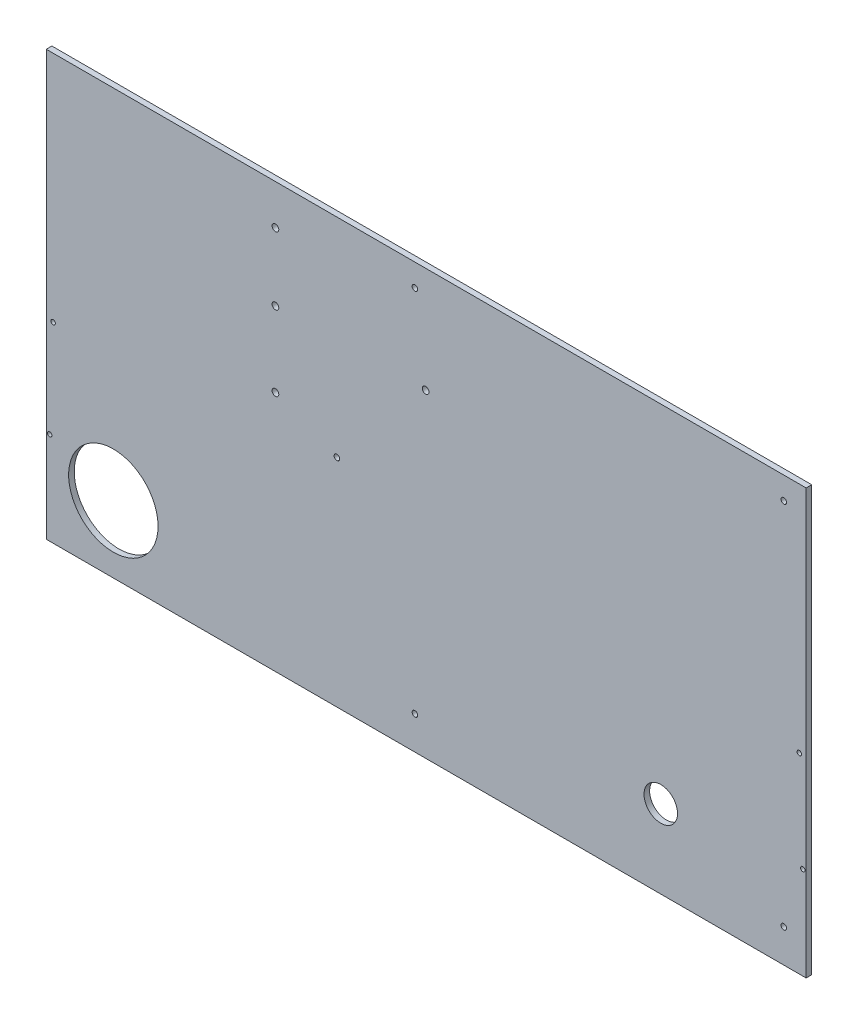
ISO-10303-21;
HEADER;
FILE_DESCRIPTION(('STEP AP214'),'2;1');
FILE_NAME('part.step','',(''),(''),'','','');
FILE_SCHEMA(('AUTOMOTIVE_DESIGN { 1 0 10303 214 1 1 1 1 }'));
ENDSEC;
DATA;
#1=APPLICATION_CONTEXT('core data for automotive mechanical design processes');
#2=APPLICATION_PROTOCOL_DEFINITION('international standard','automotive_design',2000,#1);
#3=PRODUCT_CONTEXT('',#1,'mechanical');
#4=PRODUCT('Part','Part','',(#3));
#5=PRODUCT_RELATED_PRODUCT_CATEGORY('part','',(#4));
#6=PRODUCT_DEFINITION_FORMATION('','',#4);
#7=PRODUCT_DEFINITION_CONTEXT('part definition',#1,'design');
#8=PRODUCT_DEFINITION('design','',#6,#7);
#9=PRODUCT_DEFINITION_SHAPE('','',#8);
#10=(LENGTH_UNIT() NAMED_UNIT(*) SI_UNIT(.MILLI.,.METRE.));
#11=(NAMED_UNIT(*) PLANE_ANGLE_UNIT() SI_UNIT($,.RADIAN.));
#12=(NAMED_UNIT(*) SI_UNIT($,.STERADIAN.) SOLID_ANGLE_UNIT());
#13=UNCERTAINTY_MEASURE_WITH_UNIT(LENGTH_MEASURE(1.E-05),#10,'distance_accuracy_value','');
#14=(GEOMETRIC_REPRESENTATION_CONTEXT(3) GLOBAL_UNCERTAINTY_ASSIGNED_CONTEXT((#13)) GLOBAL_UNIT_ASSIGNED_CONTEXT((#10,
#11,#12)) REPRESENTATION_CONTEXT('',''));
#15=CARTESIAN_POINT('',(0.,0.,0.));
#16=DIRECTION('',(0.,0.,1.));
#17=DIRECTION('',(1.,0.,0.));
#18=AXIS2_PLACEMENT_3D('',#15,#16,#17);
#19=CARTESIAN_POINT('',(0.,0.,6.35));
#20=DIRECTION('',(0.,0.,-1.));
#21=DIRECTION('',(-1.,0.,0.));
#22=AXIS2_PLACEMENT_3D('',#19,#20,#21);
#23=PLANE('',#22);
#24=CARTESIAN_POINT('',(-101.473,4.63549999999929,6.35));
#25=DIRECTION('',(0.,0.,1.));
#26=DIRECTION('',(1.,0.,0.));
#27=AXIS2_PLACEMENT_3D('',#24,#25,#26);
#28=CIRCLE('',#27,3.175);
#29=CARTESIAN_POINT('',(-98.2979999999996,4.63549999999929,6.35));
#30=VERTEX_POINT('',#29);
#31=EDGE_CURVE('E250',#30,#30,#28,.T.);
#32=ORIENTED_EDGE('',*,*,#31,.F.);
#33=EDGE_LOOP('',(#32));
#34=FACE_BOUND('',#33,.T.);
#35=CARTESIAN_POINT('',(-355.473,-164.9095,6.35));
#36=DIRECTION('',(0.,0.,1.));
#37=DIRECTION('',(1.,0.,0.));
#38=AXIS2_PLACEMENT_3D('',#35,#36,#37);
#39=CIRCLE('',#38,50.8);
#40=CARTESIAN_POINT('',(-304.673,-164.9095,6.35));
#41=VERTEX_POINT('',#40);
#42=EDGE_CURVE('E242',#41,#41,#39,.T.);
#43=ORIENTED_EDGE('',*,*,#42,.F.);
#44=EDGE_LOOP('',(#43));
#45=FACE_BOUND('',#44,.T.);
#46=CARTESIAN_POINT('',(406.273,215.7095,6.35));
#47=DIRECTION('',(0.,0.,1.));
#48=DIRECTION('',(1.,0.,0.));
#49=AXIS2_PLACEMENT_3D('',#46,#47,#48);
#50=CIRCLE('',#49,3.17499999999997);
#51=CARTESIAN_POINT('',(409.448,215.7095,6.35));
#52=VERTEX_POINT('',#51);
#53=EDGE_CURVE('E218',#52,#52,#50,.T.);
#54=ORIENTED_EDGE('',*,*,#53,.F.);
#55=EDGE_LOOP('',(#54));
#56=FACE_BOUND('',#55,.T.);
#57=CARTESIAN_POINT('',(406.273,-203.3905,6.35));
#58=DIRECTION('',(0.,0.,1.));
#59=DIRECTION('',(1.,0.,0.));
#60=AXIS2_PLACEMENT_3D('',#57,#58,#59);
#61=CIRCLE('',#60,3.17499999999997);
#62=CARTESIAN_POINT('',(409.448,-203.3905,6.35));
#63=VERTEX_POINT('',#62);
#64=EDGE_CURVE('E227',#63,#63,#61,.T.);
#65=ORIENTED_EDGE('',*,*,#64,.F.);
#66=EDGE_LOOP('',(#65));
#67=FACE_BOUND('',#66,.T.);
#68=CARTESIAN_POINT('',(-12.8270000000001,-203.3905,6.35));
#69=DIRECTION('',(0.,0.,1.));
#70=DIRECTION('',(1.,0.,0.));
#71=AXIS2_PLACEMENT_3D('',#68,#69,#70);
#72=CIRCLE('',#71,3.17499999999998);
#73=CARTESIAN_POINT('',(-9.65200000000011,-203.3905,6.35));
#74=VERTEX_POINT('',#73);
#75=EDGE_CURVE('E235',#74,#74,#72,.T.);
#76=ORIENTED_EDGE('',*,*,#75,.F.);
#77=EDGE_LOOP('',(#76));
#78=FACE_BOUND('',#77,.T.);
#79=CARTESIAN_POINT('',(-12.8270000000001,215.7095,6.35));
#80=DIRECTION('',(0.,0.,1.));
#81=DIRECTION('',(1.,0.,0.));
#82=AXIS2_PLACEMENT_3D('',#79,#80,#81);
#83=CIRCLE('',#82,3.17499999999998);
#84=CARTESIAN_POINT('',(-9.65200000000011,215.7095,6.35));
#85=VERTEX_POINT('',#84);
#86=EDGE_CURVE('E210',#85,#85,#83,.T.);
#87=ORIENTED_EDGE('',*,*,#86,.F.);
#88=EDGE_LOOP('',(#87));
#89=FACE_BOUND('',#88,.T.);
#90=CARTESIAN_POINT('',(-171.299738172,195.628424292552,6.35));
#91=DIRECTION('',(0.,0.,-1.));
#92=DIRECTION('',(-1.,0.,0.));
#93=AXIS2_PLACEMENT_3D('',#90,#91,#92);
#94=CIRCLE('',#93,3.81000000000002);
#95=CARTESIAN_POINT('',(-175.109738172,195.628424292552,6.35));
#96=VERTEX_POINT('',#95);
#97=EDGE_CURVE('E174',#96,#96,#94,.T.);
#98=ORIENTED_EDGE('',*,*,#97,.T.);
#99=EDGE_LOOP('',(#98));
#100=FACE_BOUND('',#99,.T.);
#101=CARTESIAN_POINT('',(-171.299738172,118.638765896112,6.35));
#102=DIRECTION('',(0.,0.,-1.));
#103=DIRECTION('',(-1.,0.,0.));
#104=AXIS2_PLACEMENT_3D('',#101,#102,#103);
#105=CIRCLE('',#104,3.81000000000001);
#106=CARTESIAN_POINT('',(-175.109738172,118.638765896112,6.35));
#107=VERTEX_POINT('',#106);
#108=EDGE_CURVE('E199',#107,#107,#105,.T.);
#109=ORIENTED_EDGE('',*,*,#108,.T.);
#110=EDGE_LOOP('',(#109));
#111=FACE_BOUND('',#110,.T.);
#112=CARTESIAN_POINT('',(-171.299738172,33.5325284381123,6.35));
#113=DIRECTION('',(0.,0.,-1.));
#114=DIRECTION('',(-1.,0.,0.));
#115=AXIS2_PLACEMENT_3D('',#112,#113,#114);
#116=CIRCLE('',#115,3.81000000000001);
#117=CARTESIAN_POINT('',(-175.109738172,33.5325284381123,6.35));
#118=VERTEX_POINT('',#117);
#119=EDGE_CURVE('E191',#118,#118,#116,.T.);
#120=ORIENTED_EDGE('',*,*,#119,.T.);
#121=EDGE_LOOP('',(#120));
#122=FACE_BOUND('',#121,.T.);
#123=CARTESIAN_POINT('',(-0.611738171951481,121.072249046552,6.35));
#124=DIRECTION('',(0.,0.,-1.));
#125=DIRECTION('',(-1.,0.,0.));
#126=AXIS2_PLACEMENT_3D('',#123,#124,#125);
#127=CIRCLE('',#126,3.81);
#128=CARTESIAN_POINT('',(-4.42173817195148,121.072249046552,6.35));
#129=VERTEX_POINT('',#128);
#130=EDGE_CURVE('E182',#129,#129,#127,.T.);
#131=ORIENTED_EDGE('',*,*,#130,.T.);
#132=EDGE_LOOP('',(#131));
#133=FACE_BOUND('',#132,.T.);
#134=CARTESIAN_POINT('',(266.528550000011,-152.344105106299,6.35));
#135=DIRECTION('',(0.,0.,1.));
#136=DIRECTION('',(1.,0.,0.));
#137=AXIS2_PLACEMENT_3D('',#134,#135,#136);
#138=CIRCLE('',#137,19.05);
#139=CARTESIAN_POINT('',(285.578550000011,-152.344105106299,6.35));
#140=VERTEX_POINT('',#139);
#141=EDGE_CURVE('E170',#140,#140,#138,.T.);
#142=ORIENTED_EDGE('',*,*,#141,.F.);
#143=EDGE_LOOP('',(#142));
#144=FACE_BOUND('',#143,.T.);
#145=DIRECTION('',(0.,1.,0.));
#146=VECTOR('',#145,1.);
#147=CARTESIAN_POINT('',(431.673,-241.1095,6.35));
#148=LINE('',#147,#146);
#149=CARTESIAN_POINT('',(431.673,-241.1095,6.35));
#150=VERTEX_POINT('',#149);
#151=CARTESIAN_POINT('',(431.673,241.1095,6.35));
#152=VERTEX_POINT('',#151);
#153=EDGE_CURVE('E97',#150,#152,#148,.T.);
#154=ORIENTED_EDGE('',*,*,#153,.T.);
#155=DIRECTION('',(-1.,0.,0.));
#156=VECTOR('',#155,1.);
#157=CARTESIAN_POINT('',(-431.673,241.1095,6.35));
#158=LINE('',#157,#156);
#159=CARTESIAN_POINT('',(-431.673,241.1095,6.35));
#160=VERTEX_POINT('',#159);
#161=EDGE_CURVE('E92',#152,#160,#158,.T.);
#162=ORIENTED_EDGE('',*,*,#161,.T.);
#163=DIRECTION('',(0.,-1.,0.));
#164=VECTOR('',#163,1.);
#165=CARTESIAN_POINT('',(-431.673,-241.1095,6.35));
#166=LINE('',#165,#164);
#167=CARTESIAN_POINT('',(-431.673,-241.1095,6.35));
#168=VERTEX_POINT('',#167);
#169=EDGE_CURVE('E95',#160,#168,#166,.T.);
#170=ORIENTED_EDGE('',*,*,#169,.T.);
#171=DIRECTION('',(1.,0.,0.));
#172=VECTOR('',#171,1.);
#173=CARTESIAN_POINT('',(-431.673,-241.1095,6.35));
#174=LINE('',#173,#172);
#175=EDGE_CURVE('E62',#168,#150,#174,.T.);
#176=ORIENTED_EDGE('',*,*,#175,.T.);
#177=EDGE_LOOP('',(#154,#162,#170,#176));
#178=FACE_BOUND('',#177,.T.);
#179=CARTESIAN_POINT('',(427.847603152867,-135.890923479345,6.35));
#180=DIRECTION('',(0.,0.,1.));
#181=DIRECTION('',(-1.,0.,0.));
#182=AXIS2_PLACEMENT_3D('',#179,#180,#181);
#183=CIRCLE('',#182,2.54000000000001);
#184=CARTESIAN_POINT('',(425.307603152867,-135.890923479345,6.35));
#185=VERTEX_POINT('',#184);
#186=EDGE_CURVE('E118',#185,#185,#183,.T.);
#187=ORIENTED_EDGE('',*,*,#186,.F.);
#188=EDGE_LOOP('',(#187));
#189=FACE_BOUND('',#188,.T.);
#190=CARTESIAN_POINT('',(-423.918892064,-23.5614445121345,6.35));
#191=DIRECTION('',(0.,0.,1.));
#192=DIRECTION('',(1.,0.,0.));
#193=AXIS2_PLACEMENT_3D('',#190,#191,#192);
#194=CIRCLE('',#193,2.54000000000001);
#195=CARTESIAN_POINT('',(-421.378892064,-23.5614445121345,6.35));
#196=VERTEX_POINT('',#195);
#197=EDGE_CURVE('E142',#196,#196,#194,.T.);
#198=ORIENTED_EDGE('',*,*,#197,.F.);
#199=EDGE_LOOP('',(#198));
#200=FACE_BOUND('',#199,.T.);
#201=CARTESIAN_POINT('',(-427.847603152867,-135.890923479345,6.35));
#202=DIRECTION('',(0.,0.,1.));
#203=DIRECTION('',(1.,0.,0.));
#204=AXIS2_PLACEMENT_3D('',#201,#202,#203);
#205=CIRCLE('',#204,2.54000000000001);
#206=CARTESIAN_POINT('',(-425.307603152867,-135.890923479345,6.35));
#207=VERTEX_POINT('',#206);
#208=EDGE_CURVE('E150',#207,#207,#205,.T.);
#209=ORIENTED_EDGE('',*,*,#208,.F.);
#210=EDGE_LOOP('',(#209));
#211=FACE_BOUND('',#210,.T.);
#212=CARTESIAN_POINT('',(423.918892064,-23.5614445121344,6.35));
#213=DIRECTION('',(0.,0.,1.));
#214=DIRECTION('',(-1.,0.,0.));
#215=AXIS2_PLACEMENT_3D('',#212,#213,#214);
#216=CIRCLE('',#215,2.54000000000001);
#217=CARTESIAN_POINT('',(421.378892064,-23.5614445121344,6.35));
#218=VERTEX_POINT('',#217);
#219=EDGE_CURVE('E158',#218,#218,#216,.T.);
#220=ORIENTED_EDGE('',*,*,#219,.F.);
#221=EDGE_LOOP('',(#220));
#222=FACE_BOUND('',#221,.T.);
#223=ADVANCED_FACE('F44',(#34,#45,#56,#67,#78,#89,#100,#111,#122,#133,#144,#178,#189,#200,#211,
#222),#23,.F.);
#224=CARTESIAN_POINT('',(0.,0.,0.));
#225=DIRECTION('',(0.,0.,-1.));
#226=DIRECTION('',(-1.,0.,0.));
#227=AXIS2_PLACEMENT_3D('',#224,#225,#226);
#228=PLANE('',#227);
#229=CARTESIAN_POINT('',(-101.473,4.63549999999929,0.));
#230=DIRECTION('',(0.,0.,1.));
#231=DIRECTION('',(1.,0.,0.));
#232=AXIS2_PLACEMENT_3D('',#229,#230,#231);
#233=CIRCLE('',#232,3.175);
#234=CARTESIAN_POINT('',(-98.2979999999996,4.63549999999929,0.));
#235=VERTEX_POINT('',#234);
#236=EDGE_CURVE('E246',#235,#235,#233,.T.);
#237=ORIENTED_EDGE('',*,*,#236,.T.);
#238=EDGE_LOOP('',(#237));
#239=FACE_BOUND('',#238,.T.);
#240=CARTESIAN_POINT('',(-355.473,-164.9095,0.));
#241=DIRECTION('',(0.,0.,1.));
#242=DIRECTION('',(1.,0.,0.));
#243=AXIS2_PLACEMENT_3D('',#240,#241,#242);
#244=CIRCLE('',#243,50.8);
#245=CARTESIAN_POINT('',(-304.673,-164.9095,0.));
#246=VERTEX_POINT('',#245);
#247=EDGE_CURVE('E223',#246,#246,#244,.T.);
#248=ORIENTED_EDGE('',*,*,#247,.T.);
#249=EDGE_LOOP('',(#248));
#250=FACE_BOUND('',#249,.T.);
#251=CARTESIAN_POINT('',(406.273,215.7095,0.));
#252=DIRECTION('',(0.,0.,1.));
#253=DIRECTION('',(1.,0.,0.));
#254=AXIS2_PLACEMENT_3D('',#251,#252,#253);
#255=CIRCLE('',#254,3.17499999999997);
#256=CARTESIAN_POINT('',(409.448,215.7095,0.));
#257=VERTEX_POINT('',#256);
#258=EDGE_CURVE('E222',#257,#257,#255,.T.);
#259=ORIENTED_EDGE('',*,*,#258,.T.);
#260=EDGE_LOOP('',(#259));
#261=FACE_BOUND('',#260,.T.);
#262=CARTESIAN_POINT('',(406.273,-203.3905,0.));
#263=DIRECTION('',(0.,0.,1.));
#264=DIRECTION('',(1.,0.,0.));
#265=AXIS2_PLACEMENT_3D('',#262,#263,#264);
#266=CIRCLE('',#265,3.17499999999997);
#267=CARTESIAN_POINT('',(409.448,-203.3905,0.));
#268=VERTEX_POINT('',#267);
#269=EDGE_CURVE('E231',#268,#268,#266,.T.);
#270=ORIENTED_EDGE('',*,*,#269,.T.);
#271=EDGE_LOOP('',(#270));
#272=FACE_BOUND('',#271,.T.);
#273=CARTESIAN_POINT('',(-12.8270000000001,-203.3905,0.));
#274=DIRECTION('',(0.,0.,1.));
#275=DIRECTION('',(1.,0.,0.));
#276=AXIS2_PLACEMENT_3D('',#273,#274,#275);
#277=CIRCLE('',#276,3.17499999999998);
#278=CARTESIAN_POINT('',(-9.65200000000011,-203.3905,0.));
#279=VERTEX_POINT('',#278);
#280=EDGE_CURVE('E214',#279,#279,#277,.T.);
#281=ORIENTED_EDGE('',*,*,#280,.T.);
#282=EDGE_LOOP('',(#281));
#283=FACE_BOUND('',#282,.T.);
#284=CARTESIAN_POINT('',(-12.8270000000001,215.7095,0.));
#285=DIRECTION('',(0.,0.,1.));
#286=DIRECTION('',(1.,0.,0.));
#287=AXIS2_PLACEMENT_3D('',#284,#285,#286);
#288=CIRCLE('',#287,3.17499999999998);
#289=CARTESIAN_POINT('',(-9.65200000000011,215.7095,0.));
#290=VERTEX_POINT('',#289);
#291=EDGE_CURVE('E183',#290,#290,#288,.T.);
#292=ORIENTED_EDGE('',*,*,#291,.T.);
#293=EDGE_LOOP('',(#292));
#294=FACE_BOUND('',#293,.T.);
#295=CARTESIAN_POINT('',(-171.299738172,195.628424292552,0.));
#296=DIRECTION('',(0.,0.,-1.));
#297=DIRECTION('',(-1.,0.,0.));
#298=AXIS2_PLACEMENT_3D('',#295,#296,#297);
#299=CIRCLE('',#298,3.81000000000002);
#300=CARTESIAN_POINT('',(-175.109738172,195.628424292552,0.));
#301=VERTEX_POINT('',#300);
#302=EDGE_CURVE('E203',#301,#301,#299,.T.);
#303=ORIENTED_EDGE('',*,*,#302,.F.);
#304=EDGE_LOOP('',(#303));
#305=FACE_BOUND('',#304,.T.);
#306=CARTESIAN_POINT('',(-171.299738172,118.638765896112,0.));
#307=DIRECTION('',(0.,0.,-1.));
#308=DIRECTION('',(-1.,0.,0.));
#309=AXIS2_PLACEMENT_3D('',#306,#307,#308);
#310=CIRCLE('',#309,3.81000000000001);
#311=CARTESIAN_POINT('',(-175.109738172,118.638765896112,0.));
#312=VERTEX_POINT('',#311);
#313=EDGE_CURVE('E195',#312,#312,#310,.T.);
#314=ORIENTED_EDGE('',*,*,#313,.F.);
#315=EDGE_LOOP('',(#314));
#316=FACE_BOUND('',#315,.T.);
#317=CARTESIAN_POINT('',(-171.299738172,33.5325284381123,0.));
#318=DIRECTION('',(0.,0.,-1.));
#319=DIRECTION('',(-1.,0.,0.));
#320=AXIS2_PLACEMENT_3D('',#317,#318,#319);
#321=CIRCLE('',#320,3.81000000000001);
#322=CARTESIAN_POINT('',(-175.109738172,33.5325284381123,0.));
#323=VERTEX_POINT('',#322);
#324=EDGE_CURVE('E187',#323,#323,#321,.T.);
#325=ORIENTED_EDGE('',*,*,#324,.F.);
#326=EDGE_LOOP('',(#325));
#327=FACE_BOUND('',#326,.T.);
#328=CARTESIAN_POINT('',(-0.611738171951481,121.072249046552,0.));
#329=DIRECTION('',(0.,0.,-1.));
#330=DIRECTION('',(-1.,0.,0.));
#331=AXIS2_PLACEMENT_3D('',#328,#329,#330);
#332=CIRCLE('',#331,3.81);
#333=CARTESIAN_POINT('',(-4.42173817195148,121.072249046552,0.));
#334=VERTEX_POINT('',#333);
#335=EDGE_CURVE('E178',#334,#334,#332,.T.);
#336=ORIENTED_EDGE('',*,*,#335,.F.);
#337=EDGE_LOOP('',(#336));
#338=FACE_BOUND('',#337,.T.);
#339=CARTESIAN_POINT('',(266.528550000011,-152.344105106299,0.));
#340=DIRECTION('',(0.,0.,1.));
#341=DIRECTION('',(1.,0.,0.));
#342=AXIS2_PLACEMENT_3D('',#339,#340,#341);
#343=CIRCLE('',#342,19.05);
#344=CARTESIAN_POINT('',(285.578550000011,-152.344105106299,0.));
#345=VERTEX_POINT('',#344);
#346=EDGE_CURVE('E166',#345,#345,#343,.T.);
#347=ORIENTED_EDGE('',*,*,#346,.T.);
#348=EDGE_LOOP('',(#347));
#349=FACE_BOUND('',#348,.T.);
#350=CARTESIAN_POINT('',(-427.847603152867,-135.890923479345,0.));
#351=DIRECTION('',(0.,0.,1.));
#352=DIRECTION('',(1.,0.,0.));
#353=AXIS2_PLACEMENT_3D('',#350,#351,#352);
#354=CIRCLE('',#353,2.54000000000001);
#355=CARTESIAN_POINT('',(-425.307603152867,-135.890923479345,0.));
#356=VERTEX_POINT('',#355);
#357=EDGE_CURVE('E154',#356,#356,#354,.T.);
#358=ORIENTED_EDGE('',*,*,#357,.T.);
#359=EDGE_LOOP('',(#358));
#360=FACE_BOUND('',#359,.T.);
#361=CARTESIAN_POINT('',(427.847603152867,-135.890923479345,0.));
#362=DIRECTION('',(0.,0.,1.));
#363=DIRECTION('',(-1.,0.,0.));
#364=AXIS2_PLACEMENT_3D('',#361,#362,#363);
#365=CIRCLE('',#364,2.54000000000001);
#366=CARTESIAN_POINT('',(425.307603152867,-135.890923479345,0.));
#367=VERTEX_POINT('',#366);
#368=EDGE_CURVE('E138',#367,#367,#365,.T.);
#369=ORIENTED_EDGE('',*,*,#368,.T.);
#370=EDGE_LOOP('',(#369));
#371=FACE_BOUND('',#370,.T.);
#372=DIRECTION('',(0.,1.,0.));
#373=VECTOR('',#372,1.);
#374=CARTESIAN_POINT('',(431.673,-241.1095,0.));
#375=LINE('',#374,#373);
#376=CARTESIAN_POINT('',(431.673,-241.1095,0.));
#377=VERTEX_POINT('',#376);
#378=CARTESIAN_POINT('',(431.673,241.1095,0.));
#379=VERTEX_POINT('',#378);
#380=EDGE_CURVE('E114',#377,#379,#375,.T.);
#381=ORIENTED_EDGE('',*,*,#380,.F.);
#382=DIRECTION('',(1.,0.,0.));
#383=VECTOR('',#382,1.);
#384=CARTESIAN_POINT('',(-431.673,-241.1095,0.));
#385=LINE('',#384,#383);
#386=CARTESIAN_POINT('',(-431.673,-241.1095,0.));
#387=VERTEX_POINT('',#386);
#388=EDGE_CURVE('E85',#387,#377,#385,.T.);
#389=ORIENTED_EDGE('',*,*,#388,.F.);
#390=DIRECTION('',(0.,-1.,0.));
#391=VECTOR('',#390,1.);
#392=CARTESIAN_POINT('',(-431.673,-241.1095,0.));
#393=LINE('',#392,#391);
#394=CARTESIAN_POINT('',(-431.673,241.1095,0.));
#395=VERTEX_POINT('',#394);
#396=EDGE_CURVE('E79',#395,#387,#393,.T.);
#397=ORIENTED_EDGE('',*,*,#396,.F.);
#398=DIRECTION('',(-1.,0.,0.));
#399=VECTOR('',#398,1.);
#400=CARTESIAN_POINT('',(-431.673,241.1095,0.));
#401=LINE('',#400,#399);
#402=EDGE_CURVE('E102',#379,#395,#401,.T.);
#403=ORIENTED_EDGE('',*,*,#402,.F.);
#404=EDGE_LOOP('',(#381,#389,#397,#403));
#405=FACE_BOUND('',#404,.T.);
#406=CARTESIAN_POINT('',(-423.918892064,-23.5614445121345,0.));
#407=DIRECTION('',(0.,0.,1.));
#408=DIRECTION('',(1.,0.,0.));
#409=AXIS2_PLACEMENT_3D('',#406,#407,#408);
#410=CIRCLE('',#409,2.54000000000001);
#411=CARTESIAN_POINT('',(-421.378892064,-23.5614445121345,0.));
#412=VERTEX_POINT('',#411);
#413=EDGE_CURVE('E146',#412,#412,#410,.T.);
#414=ORIENTED_EDGE('',*,*,#413,.T.);
#415=EDGE_LOOP('',(#414));
#416=FACE_BOUND('',#415,.T.);
#417=CARTESIAN_POINT('',(423.918892064,-23.5614445121344,0.));
#418=DIRECTION('',(0.,0.,1.));
#419=DIRECTION('',(-1.,0.,0.));
#420=AXIS2_PLACEMENT_3D('',#417,#418,#419);
#421=CIRCLE('',#420,2.54000000000001);
#422=CARTESIAN_POINT('',(421.378892064,-23.5614445121344,0.));
#423=VERTEX_POINT('',#422);
#424=EDGE_CURVE('E162',#423,#423,#421,.T.);
#425=ORIENTED_EDGE('',*,*,#424,.T.);
#426=EDGE_LOOP('',(#425));
#427=FACE_BOUND('',#426,.T.);
#428=ADVANCED_FACE('F132',(#239,#250,#261,#272,#283,#294,#305,#316,#327,#338,#349,#360,#371,
#405,#416,#427),#228,.T.);
#429=CARTESIAN_POINT('',(431.673,-241.1095,6.35));
#430=DIRECTION('',(-1.,0.,0.));
#431=DIRECTION('',(0.,-1.,0.));
#432=AXIS2_PLACEMENT_3D('',#429,#430,#431);
#433=PLANE('',#432);
#434=ORIENTED_EDGE('',*,*,#380,.T.);
#435=DIRECTION('',(0.,0.,-1.));
#436=VECTOR('',#435,1.);
#437=CARTESIAN_POINT('',(431.673,241.1095,6.35));
#438=LINE('',#437,#436);
#439=EDGE_CURVE('E11',#152,#379,#438,.T.);
#440=ORIENTED_EDGE('',*,*,#439,.F.);
#441=ORIENTED_EDGE('',*,*,#153,.F.);
#442=DIRECTION('',(0.,0.,-1.));
#443=VECTOR('',#442,1.);
#444=CARTESIAN_POINT('',(431.673,-241.1095,6.35));
#445=LINE('',#444,#443);
#446=EDGE_CURVE('E110',#150,#377,#445,.T.);
#447=ORIENTED_EDGE('',*,*,#446,.T.);
#448=EDGE_LOOP('',(#434,#440,#441,#447));
#449=FACE_BOUND('',#448,.T.);
#450=ADVANCED_FACE('F46',(#449),#433,.F.);
#451=CARTESIAN_POINT('',(-431.673,241.1095,6.35));
#452=DIRECTION('',(0.,-1.,0.));
#453=DIRECTION('',(1.,0.,0.));
#454=AXIS2_PLACEMENT_3D('',#451,#452,#453);
#455=PLANE('',#454);
#456=ORIENTED_EDGE('',*,*,#402,.T.);
#457=DIRECTION('',(0.,0.,-1.));
#458=VECTOR('',#457,1.);
#459=CARTESIAN_POINT('',(-431.673,241.1095,6.35));
#460=LINE('',#459,#458);
#461=EDGE_CURVE('E54',#160,#395,#460,.T.);
#462=ORIENTED_EDGE('',*,*,#461,.F.);
#463=ORIENTED_EDGE('',*,*,#161,.F.);
#464=ORIENTED_EDGE('',*,*,#439,.T.);
#465=EDGE_LOOP('',(#456,#462,#463,#464));
#466=FACE_BOUND('',#465,.T.);
#467=ADVANCED_FACE('F101',(#466),#455,.F.);
#468=CARTESIAN_POINT('',(-431.673,-241.1095,6.35));
#469=DIRECTION('',(1.,0.,0.));
#470=DIRECTION('',(0.,1.,0.));
#471=AXIS2_PLACEMENT_3D('',#468,#469,#470);
#472=PLANE('',#471);
#473=ORIENTED_EDGE('',*,*,#396,.T.);
#474=DIRECTION('',(0.,0.,-1.));
#475=VECTOR('',#474,1.);
#476=CARTESIAN_POINT('',(-431.673,-241.1095,6.35));
#477=LINE('',#476,#475);
#478=EDGE_CURVE('E104',#168,#387,#477,.T.);
#479=ORIENTED_EDGE('',*,*,#478,.F.);
#480=ORIENTED_EDGE('',*,*,#169,.F.);
#481=ORIENTED_EDGE('',*,*,#461,.T.);
#482=EDGE_LOOP('',(#473,#479,#480,#481));
#483=FACE_BOUND('',#482,.T.);
#484=ADVANCED_FACE('F105',(#483),#472,.F.);
#485=CARTESIAN_POINT('',(-431.673,-241.1095,6.35));
#486=DIRECTION('',(0.,1.,0.));
#487=DIRECTION('',(-1.,0.,0.));
#488=AXIS2_PLACEMENT_3D('',#485,#486,#487);
#489=PLANE('',#488);
#490=ORIENTED_EDGE('',*,*,#388,.T.);
#491=ORIENTED_EDGE('',*,*,#446,.F.);
#492=ORIENTED_EDGE('',*,*,#175,.F.);
#493=ORIENTED_EDGE('',*,*,#478,.T.);
#494=EDGE_LOOP('',(#490,#491,#492,#493));
#495=FACE_BOUND('',#494,.T.);
#496=ADVANCED_FACE('F129',(#495),#489,.F.);
#497=CARTESIAN_POINT('',(427.847603152867,-135.890923479345,6.35));
#498=DIRECTION('',(0.,0.,-1.));
#499=DIRECTION('',(-1.,0.,0.));
#500=AXIS2_PLACEMENT_3D('',#497,#498,#499);
#501=CYLINDRICAL_SURFACE('',#500,2.54000000000001);
#502=ORIENTED_EDGE('',*,*,#186,.T.);
#503=EDGE_LOOP('',(#502));
#504=FACE_BOUND('',#503,.T.);
#505=ORIENTED_EDGE('',*,*,#368,.F.);
#506=EDGE_LOOP('',(#505));
#507=FACE_BOUND('',#506,.T.);
#508=ADVANCED_FACE('F315',(#504,#507),#501,.F.);
#509=CARTESIAN_POINT('',(-423.918892064,-23.5614445121345,6.35));
#510=DIRECTION('',(0.,0.,-1.));
#511=DIRECTION('',(-1.,0.,0.));
#512=AXIS2_PLACEMENT_3D('',#509,#510,#511);
#513=CYLINDRICAL_SURFACE('',#512,2.54000000000001);
#514=ORIENTED_EDGE('',*,*,#197,.T.);
#515=EDGE_LOOP('',(#514));
#516=FACE_BOUND('',#515,.T.);
#517=ORIENTED_EDGE('',*,*,#413,.F.);
#518=EDGE_LOOP('',(#517));
#519=FACE_BOUND('',#518,.T.);
#520=ADVANCED_FACE('F311',(#516,#519),#513,.F.);
#521=CARTESIAN_POINT('',(-427.847603152867,-135.890923479345,6.35));
#522=DIRECTION('',(0.,0.,-1.));
#523=DIRECTION('',(-1.,0.,0.));
#524=AXIS2_PLACEMENT_3D('',#521,#522,#523);
#525=CYLINDRICAL_SURFACE('',#524,2.54000000000001);
#526=ORIENTED_EDGE('',*,*,#208,.T.);
#527=EDGE_LOOP('',(#526));
#528=FACE_BOUND('',#527,.T.);
#529=ORIENTED_EDGE('',*,*,#357,.F.);
#530=EDGE_LOOP('',(#529));
#531=FACE_BOUND('',#530,.T.);
#532=ADVANCED_FACE('F303',(#528,#531),#525,.F.);
#533=CARTESIAN_POINT('',(423.918892064,-23.5614445121344,6.35));
#534=DIRECTION('',(0.,0.,-1.));
#535=DIRECTION('',(-1.,0.,0.));
#536=AXIS2_PLACEMENT_3D('',#533,#534,#535);
#537=CYLINDRICAL_SURFACE('',#536,2.54000000000001);
#538=ORIENTED_EDGE('',*,*,#219,.T.);
#539=EDGE_LOOP('',(#538));
#540=FACE_BOUND('',#539,.T.);
#541=ORIENTED_EDGE('',*,*,#424,.F.);
#542=EDGE_LOOP('',(#541));
#543=FACE_BOUND('',#542,.T.);
#544=ADVANCED_FACE('F293',(#540,#543),#537,.F.);
#545=CARTESIAN_POINT('',(266.528550000011,-152.344105106299,0.));
#546=DIRECTION('',(0.,0.,1.));
#547=DIRECTION('',(1.,0.,0.));
#548=AXIS2_PLACEMENT_3D('',#545,#546,#547);
#549=CYLINDRICAL_SURFACE('',#548,19.05);
#550=ORIENTED_EDGE('',*,*,#346,.F.);
#551=EDGE_LOOP('',(#550));
#552=FACE_BOUND('',#551,.T.);
#553=ORIENTED_EDGE('',*,*,#141,.T.);
#554=EDGE_LOOP('',(#553));
#555=FACE_BOUND('',#554,.T.);
#556=ADVANCED_FACE('F290',(#552,#555),#549,.F.);
#557=CARTESIAN_POINT('',(-0.611738171951481,121.072249046552,6.35));
#558=DIRECTION('',(0.,0.,-1.));
#559=DIRECTION('',(-1.,0.,0.));
#560=AXIS2_PLACEMENT_3D('',#557,#558,#559);
#561=CYLINDRICAL_SURFACE('',#560,3.81);
#562=ORIENTED_EDGE('',*,*,#130,.F.);
#563=EDGE_LOOP('',(#562));
#564=FACE_BOUND('',#563,.T.);
#565=ORIENTED_EDGE('',*,*,#335,.T.);
#566=EDGE_LOOP('',(#565));
#567=FACE_BOUND('',#566,.T.);
#568=ADVANCED_FACE('F292',(#564,#567),#561,.F.);
#569=CARTESIAN_POINT('',(-171.299738172,33.5325284381123,6.35));
#570=DIRECTION('',(0.,0.,-1.));
#571=DIRECTION('',(-1.,0.,0.));
#572=AXIS2_PLACEMENT_3D('',#569,#570,#571);
#573=CYLINDRICAL_SURFACE('',#572,3.81000000000001);
#574=ORIENTED_EDGE('',*,*,#119,.F.);
#575=EDGE_LOOP('',(#574));
#576=FACE_BOUND('',#575,.T.);
#577=ORIENTED_EDGE('',*,*,#324,.T.);
#578=EDGE_LOOP('',(#577));
#579=FACE_BOUND('',#578,.T.);
#580=ADVANCED_FACE('F300',(#576,#579),#573,.F.);
#581=CARTESIAN_POINT('',(-171.299738172,118.638765896112,6.35));
#582=DIRECTION('',(0.,0.,-1.));
#583=DIRECTION('',(-1.,0.,0.));
#584=AXIS2_PLACEMENT_3D('',#581,#582,#583);
#585=CYLINDRICAL_SURFACE('',#584,3.81000000000001);
#586=ORIENTED_EDGE('',*,*,#108,.F.);
#587=EDGE_LOOP('',(#586));
#588=FACE_BOUND('',#587,.T.);
#589=ORIENTED_EDGE('',*,*,#313,.T.);
#590=EDGE_LOOP('',(#589));
#591=FACE_BOUND('',#590,.T.);
#592=ADVANCED_FACE('F406',(#588,#591),#585,.F.);
#593=CARTESIAN_POINT('',(-171.299738172,195.628424292552,6.35));
#594=DIRECTION('',(0.,0.,-1.));
#595=DIRECTION('',(-1.,0.,0.));
#596=AXIS2_PLACEMENT_3D('',#593,#594,#595);
#597=CYLINDRICAL_SURFACE('',#596,3.81000000000002);
#598=ORIENTED_EDGE('',*,*,#97,.F.);
#599=EDGE_LOOP('',(#598));
#600=FACE_BOUND('',#599,.T.);
#601=ORIENTED_EDGE('',*,*,#302,.T.);
#602=EDGE_LOOP('',(#601));
#603=FACE_BOUND('',#602,.T.);
#604=ADVANCED_FACE('F395',(#600,#603),#597,.F.);
#605=CARTESIAN_POINT('',(-12.8270000000001,215.7095,0.));
#606=DIRECTION('',(0.,0.,1.));
#607=DIRECTION('',(1.,0.,0.));
#608=AXIS2_PLACEMENT_3D('',#605,#606,#607);
#609=CYLINDRICAL_SURFACE('',#608,3.17499999999998);
#610=ORIENTED_EDGE('',*,*,#291,.F.);
#611=EDGE_LOOP('',(#610));
#612=FACE_BOUND('',#611,.T.);
#613=ORIENTED_EDGE('',*,*,#86,.T.);
#614=EDGE_LOOP('',(#613));
#615=FACE_BOUND('',#614,.T.);
#616=ADVANCED_FACE('F384',(#612,#615),#609,.F.);
#617=CARTESIAN_POINT('',(-12.8270000000001,-203.3905,0.));
#618=DIRECTION('',(0.,0.,1.));
#619=DIRECTION('',(1.,0.,0.));
#620=AXIS2_PLACEMENT_3D('',#617,#618,#619);
#621=CYLINDRICAL_SURFACE('',#620,3.17499999999998);
#622=ORIENTED_EDGE('',*,*,#280,.F.);
#623=EDGE_LOOP('',(#622));
#624=FACE_BOUND('',#623,.T.);
#625=ORIENTED_EDGE('',*,*,#75,.T.);
#626=EDGE_LOOP('',(#625));
#627=FACE_BOUND('',#626,.T.);
#628=ADVANCED_FACE('F373',(#624,#627),#621,.F.);
#629=CARTESIAN_POINT('',(406.273,-203.3905,0.));
#630=DIRECTION('',(0.,0.,1.));
#631=DIRECTION('',(1.,0.,0.));
#632=AXIS2_PLACEMENT_3D('',#629,#630,#631);
#633=CYLINDRICAL_SURFACE('',#632,3.17499999999997);
#634=ORIENTED_EDGE('',*,*,#269,.F.);
#635=EDGE_LOOP('',(#634));
#636=FACE_BOUND('',#635,.T.);
#637=ORIENTED_EDGE('',*,*,#64,.T.);
#638=EDGE_LOOP('',(#637));
#639=FACE_BOUND('',#638,.T.);
#640=ADVANCED_FACE('F362',(#636,#639),#633,.F.);
#641=CARTESIAN_POINT('',(406.273,215.7095,0.));
#642=DIRECTION('',(0.,0.,1.));
#643=DIRECTION('',(1.,0.,0.));
#644=AXIS2_PLACEMENT_3D('',#641,#642,#643);
#645=CYLINDRICAL_SURFACE('',#644,3.17499999999997);
#646=ORIENTED_EDGE('',*,*,#258,.F.);
#647=EDGE_LOOP('',(#646));
#648=FACE_BOUND('',#647,.T.);
#649=ORIENTED_EDGE('',*,*,#53,.T.);
#650=EDGE_LOOP('',(#649));
#651=FACE_BOUND('',#650,.T.);
#652=ADVANCED_FACE('F350',(#648,#651),#645,.F.);
#653=CARTESIAN_POINT('',(-355.473,-164.9095,0.));
#654=DIRECTION('',(0.,0.,1.));
#655=DIRECTION('',(1.,0.,0.));
#656=AXIS2_PLACEMENT_3D('',#653,#654,#655);
#657=CYLINDRICAL_SURFACE('',#656,50.8);
#658=ORIENTED_EDGE('',*,*,#247,.F.);
#659=EDGE_LOOP('',(#658));
#660=FACE_BOUND('',#659,.T.);
#661=ORIENTED_EDGE('',*,*,#42,.T.);
#662=EDGE_LOOP('',(#661));
#663=FACE_BOUND('',#662,.T.);
#664=ADVANCED_FACE('F263',(#660,#663),#657,.F.);
#665=CARTESIAN_POINT('',(-101.473,4.63549999999929,0.));
#666=DIRECTION('',(0.,0.,1.));
#667=DIRECTION('',(1.,0.,0.));
#668=AXIS2_PLACEMENT_3D('',#665,#666,#667);
#669=CYLINDRICAL_SURFACE('',#668,3.175);
#670=ORIENTED_EDGE('',*,*,#236,.F.);
#671=EDGE_LOOP('',(#670));
#672=FACE_BOUND('',#671,.T.);
#673=ORIENTED_EDGE('',*,*,#31,.T.);
#674=EDGE_LOOP('',(#673));
#675=FACE_BOUND('',#674,.T.);
#676=ADVANCED_FACE('F260',(#672,#675),#669,.F.);
#677=CLOSED_SHELL('',(#223,#428,#450,#467,#484,#496,#508,#520,#532,#544,#556,#568,#580,#592,
#604,#616,#628,#640,#652,#664,#676));
#678=MANIFOLD_SOLID_BREP('B2',#677);
#679=ADVANCED_BREP_SHAPE_REPRESENTATION('',(#18,#678),#14);
#680=SHAPE_DEFINITION_REPRESENTATION(#9,#679);
ENDSEC;
END-ISO-10303-21;
